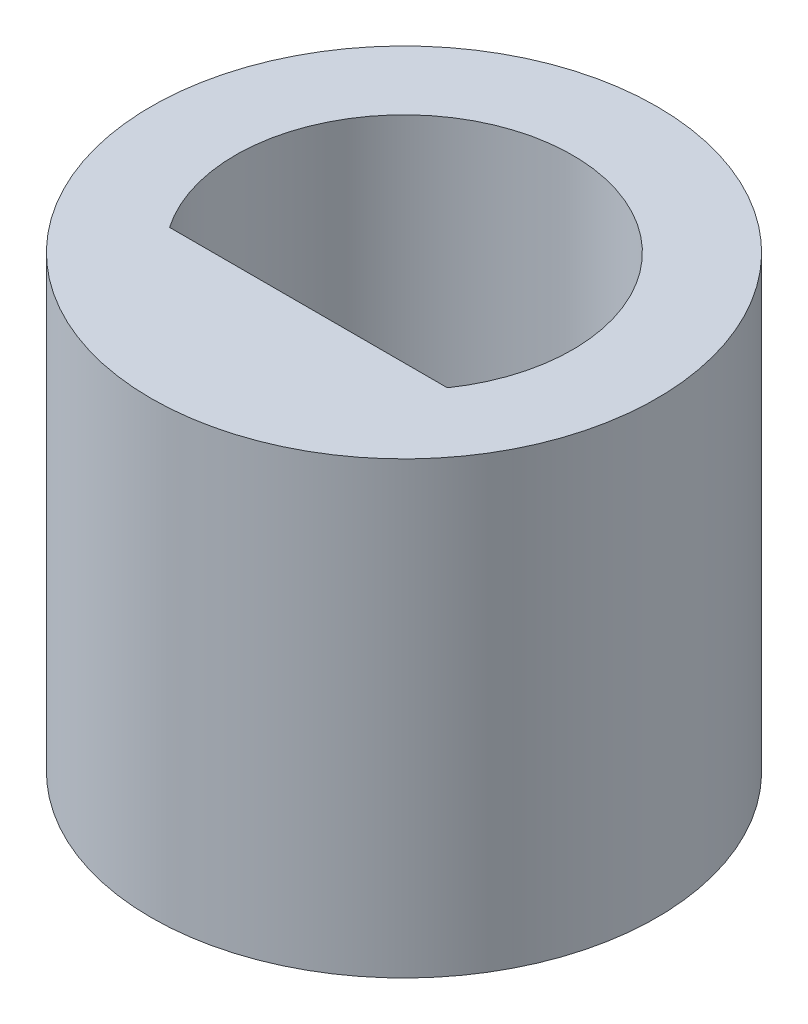
ISO-10303-21;
HEADER;
FILE_DESCRIPTION(('STEP AP214'),'2;1');
FILE_NAME('part.step','',(''),(''),'','','');
FILE_SCHEMA(('AUTOMOTIVE_DESIGN { 1 0 10303 214 1 1 1 1 }'));
ENDSEC;
DATA;
#1=APPLICATION_CONTEXT('core data for automotive mechanical design processes');
#2=APPLICATION_PROTOCOL_DEFINITION('international standard','automotive_design',2000,#1);
#3=PRODUCT_CONTEXT('',#1,'mechanical');
#4=PRODUCT('Part','Part','',(#3));
#5=PRODUCT_RELATED_PRODUCT_CATEGORY('part','',(#4));
#6=PRODUCT_DEFINITION_FORMATION('','',#4);
#7=PRODUCT_DEFINITION_CONTEXT('part definition',#1,'design');
#8=PRODUCT_DEFINITION('design','',#6,#7);
#9=PRODUCT_DEFINITION_SHAPE('','',#8);
#10=(LENGTH_UNIT() NAMED_UNIT(*) SI_UNIT(.MILLI.,.METRE.));
#11=(NAMED_UNIT(*) PLANE_ANGLE_UNIT() SI_UNIT($,.RADIAN.));
#12=(NAMED_UNIT(*) SI_UNIT($,.STERADIAN.) SOLID_ANGLE_UNIT());
#13=UNCERTAINTY_MEASURE_WITH_UNIT(LENGTH_MEASURE(1.E-05),#10,'distance_accuracy_value','');
#14=(GEOMETRIC_REPRESENTATION_CONTEXT(3) GLOBAL_UNCERTAINTY_ASSIGNED_CONTEXT((#13)) GLOBAL_UNIT_ASSIGNED_CONTEXT((#10,
#11,#12)) REPRESENTATION_CONTEXT('',''));
#15=CARTESIAN_POINT('',(0.,0.,0.));
#16=DIRECTION('',(0.,0.,1.));
#17=DIRECTION('',(1.,0.,0.));
#18=AXIS2_PLACEMENT_3D('',#15,#16,#17);
#19=CARTESIAN_POINT('',(0.,4.,0.));
#20=DIRECTION('',(0.,-1.,0.));
#21=DIRECTION('',(0.,0.,-1.));
#22=AXIS2_PLACEMENT_3D('',#19,#20,#21);
#23=CYLINDRICAL_SURFACE('',#22,1.5);
#24=CARTESIAN_POINT('',(0.,0.5,0.));
#25=DIRECTION('',(0.,1.,0.));
#26=DIRECTION('',(0.,0.,1.));
#27=AXIS2_PLACEMENT_3D('',#24,#25,#26);
#28=CIRCLE('',#27,1.5);
#29=CARTESIAN_POINT('',(1.23592070943083,0.5,0.85));
#30=VERTEX_POINT('',#29);
#31=CARTESIAN_POINT('',(-1.23592070943083,0.5,0.85));
#32=VERTEX_POINT('',#31);
#33=EDGE_CURVE('E66',#30,#32,#28,.T.);
#34=ORIENTED_EDGE('',*,*,#33,.F.);
#35=DIRECTION('',(0.,-1.,0.));
#36=VECTOR('',#35,1.);
#37=CARTESIAN_POINT('',(1.23592070943083,4.,0.85));
#38=LINE('',#37,#36);
#39=CARTESIAN_POINT('',(1.23592070943083,4.,0.85));
#40=VERTEX_POINT('',#39);
#41=EDGE_CURVE('E48',#40,#30,#38,.T.);
#42=ORIENTED_EDGE('',*,*,#41,.F.);
#43=CARTESIAN_POINT('',(0.,4.,0.));
#44=DIRECTION('',(0.,1.,0.));
#45=DIRECTION('',(0.,0.,1.));
#46=AXIS2_PLACEMENT_3D('',#43,#44,#45);
#47=CIRCLE('',#46,1.5);
#48=CARTESIAN_POINT('',(-1.23592070943083,4.,0.85));
#49=VERTEX_POINT('',#48);
#50=EDGE_CURVE('E99',#40,#49,#47,.T.);
#51=ORIENTED_EDGE('',*,*,#50,.T.);
#52=DIRECTION('',(0.,-1.,0.));
#53=VECTOR('',#52,1.);
#54=CARTESIAN_POINT('',(-1.23592070943083,4.,0.85));
#55=LINE('',#54,#53);
#56=EDGE_CURVE('E60',#49,#32,#55,.T.);
#57=ORIENTED_EDGE('',*,*,#56,.T.);
#58=EDGE_LOOP('',(#34,#42,#51,#57));
#59=FACE_BOUND('',#58,.T.);
#60=ADVANCED_FACE('F41',(#59),#23,.F.);
#61=CARTESIAN_POINT('',(0.,4.,0.85));
#62=DIRECTION('',(0.,0.,-1.));
#63=DIRECTION('',(-1.,0.,0.));
#64=AXIS2_PLACEMENT_3D('',#61,#62,#63);
#65=PLANE('',#64);
#66=DIRECTION('',(1.,0.,0.));
#67=VECTOR('',#66,1.);
#68=CARTESIAN_POINT('',(0.,0.5,0.85));
#69=LINE('',#68,#67);
#70=EDGE_CURVE('E11',#32,#30,#69,.T.);
#71=ORIENTED_EDGE('',*,*,#70,.F.);
#72=ORIENTED_EDGE('',*,*,#56,.F.);
#73=DIRECTION('',(1.,0.,0.));
#74=VECTOR('',#73,1.);
#75=CARTESIAN_POINT('',(0.,4.,0.85));
#76=LINE('',#75,#74);
#77=EDGE_CURVE('E67',#49,#40,#76,.T.);
#78=ORIENTED_EDGE('',*,*,#77,.T.);
#79=ORIENTED_EDGE('',*,*,#41,.T.);
#80=EDGE_LOOP('',(#71,#72,#78,#79));
#81=FACE_BOUND('',#80,.T.);
#82=ADVANCED_FACE('F63',(#81),#65,.T.);
#83=CARTESIAN_POINT('',(0.,4.,0.));
#84=DIRECTION('',(0.,-1.,0.));
#85=DIRECTION('',(0.,0.,-1.));
#86=AXIS2_PLACEMENT_3D('',#83,#84,#85);
#87=CYLINDRICAL_SURFACE('',#86,2.25);
#88=CARTESIAN_POINT('',(0.,4.,0.));
#89=DIRECTION('',(0.,1.,0.));
#90=DIRECTION('',(0.,0.,1.));
#91=AXIS2_PLACEMENT_3D('',#88,#89,#90);
#92=CIRCLE('',#91,2.25);
#93=CARTESIAN_POINT('',(0.,4.,2.25));
#94=VERTEX_POINT('',#93);
#95=EDGE_CURVE('E103',#94,#94,#92,.T.);
#96=ORIENTED_EDGE('',*,*,#95,.F.);
#97=EDGE_LOOP('',(#96));
#98=FACE_BOUND('',#97,.T.);
#99=CARTESIAN_POINT('',(0.,0.,0.));
#100=DIRECTION('',(0.,1.,0.));
#101=DIRECTION('',(0.,0.,1.));
#102=AXIS2_PLACEMENT_3D('',#99,#100,#101);
#103=CIRCLE('',#102,2.25);
#104=CARTESIAN_POINT('',(0.,0.,2.25));
#105=VERTEX_POINT('',#104);
#106=EDGE_CURVE('E75',#105,#105,#103,.T.);
#107=ORIENTED_EDGE('',*,*,#106,.T.);
#108=EDGE_LOOP('',(#107));
#109=FACE_BOUND('',#108,.T.);
#110=ADVANCED_FACE('F89',(#98,#109),#87,.T.);
#111=CARTESIAN_POINT('',(0.,4.,0.));
#112=DIRECTION('',(0.,1.,0.));
#113=DIRECTION('',(0.,0.,1.));
#114=AXIS2_PLACEMENT_3D('',#111,#112,#113);
#115=PLANE('',#114);
#116=ORIENTED_EDGE('',*,*,#50,.F.);
#117=ORIENTED_EDGE('',*,*,#77,.F.);
#118=EDGE_LOOP('',(#116,#117));
#119=FACE_BOUND('',#118,.T.);
#120=ORIENTED_EDGE('',*,*,#95,.T.);
#121=EDGE_LOOP('',(#120));
#122=FACE_BOUND('',#121,.T.);
#123=ADVANCED_FACE('F82',(#119,#122),#115,.T.);
#124=CARTESIAN_POINT('',(0.,0.,0.));
#125=DIRECTION('',(0.,1.,0.));
#126=DIRECTION('',(0.,0.,1.));
#127=AXIS2_PLACEMENT_3D('',#124,#125,#126);
#128=PLANE('',#127);
#129=ORIENTED_EDGE('',*,*,#106,.F.);
#130=EDGE_LOOP('',(#129));
#131=FACE_BOUND('',#130,.T.);
#132=ADVANCED_FACE('F76',(#131),#128,.F.);
#133=CARTESIAN_POINT('',(0.,0.5,0.));
#134=DIRECTION('',(0.,1.,0.));
#135=DIRECTION('',(0.,0.,1.));
#136=AXIS2_PLACEMENT_3D('',#133,#134,#135);
#137=PLANE('',#136);
#138=ORIENTED_EDGE('',*,*,#33,.T.);
#139=ORIENTED_EDGE('',*,*,#70,.T.);
#140=EDGE_LOOP('',(#138,#139));
#141=FACE_BOUND('',#140,.T.);
#142=ADVANCED_FACE('F74',(#141),#137,.T.);
#143=CLOSED_SHELL('',(#60,#82,#110,#123,#132,#142));
#144=MANIFOLD_SOLID_BREP('B2',#143);
#145=ADVANCED_BREP_SHAPE_REPRESENTATION('',(#18,#144),#14);
#146=SHAPE_DEFINITION_REPRESENTATION(#9,#145);
ENDSEC;
END-ISO-10303-21;
